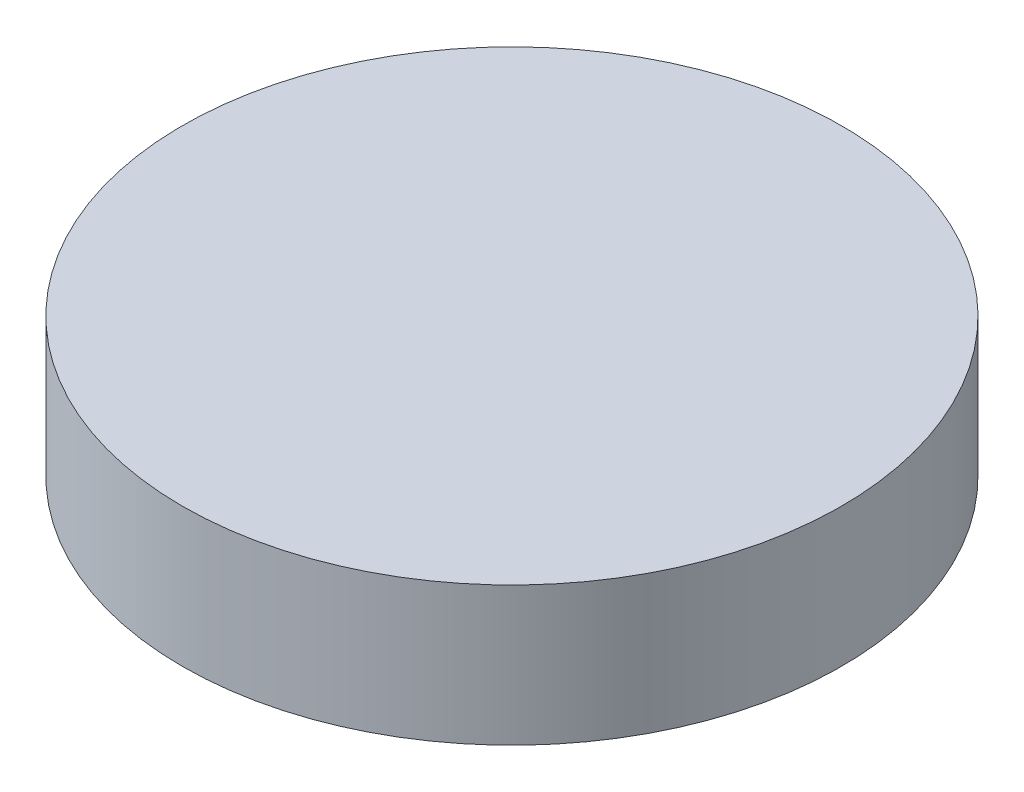
ISO-10303-21;
HEADER;
FILE_DESCRIPTION(('STEP AP214'),'2;1');
FILE_NAME('part.step','',(''),(''),'','','');
FILE_SCHEMA(('AUTOMOTIVE_DESIGN { 1 0 10303 214 1 1 1 1 }'));
ENDSEC;
DATA;
#1=APPLICATION_CONTEXT('core data for automotive mechanical design processes');
#2=APPLICATION_PROTOCOL_DEFINITION('international standard','automotive_design',2000,#1);
#3=PRODUCT_CONTEXT('',#1,'mechanical');
#4=PRODUCT('Part','Part','',(#3));
#5=PRODUCT_RELATED_PRODUCT_CATEGORY('part','',(#4));
#6=PRODUCT_DEFINITION_FORMATION('','',#4);
#7=PRODUCT_DEFINITION_CONTEXT('part definition',#1,'design');
#8=PRODUCT_DEFINITION('design','',#6,#7);
#9=PRODUCT_DEFINITION_SHAPE('','',#8);
#10=(LENGTH_UNIT() NAMED_UNIT(*) SI_UNIT(.MILLI.,.METRE.));
#11=(NAMED_UNIT(*) PLANE_ANGLE_UNIT() SI_UNIT($,.RADIAN.));
#12=(NAMED_UNIT(*) SI_UNIT($,.STERADIAN.) SOLID_ANGLE_UNIT());
#13=UNCERTAINTY_MEASURE_WITH_UNIT(LENGTH_MEASURE(1.E-05),#10,'distance_accuracy_value','');
#14=(GEOMETRIC_REPRESENTATION_CONTEXT(3) GLOBAL_UNCERTAINTY_ASSIGNED_CONTEXT((#13)) GLOBAL_UNIT_ASSIGNED_CONTEXT((#10,
#11,#12)) REPRESENTATION_CONTEXT('',''));
#15=CARTESIAN_POINT('',(0.,0.,0.));
#16=DIRECTION('',(0.,0.,1.));
#17=DIRECTION('',(1.,0.,0.));
#18=AXIS2_PLACEMENT_3D('',#15,#16,#17);
#19=CARTESIAN_POINT('',(0.,4.,0.));
#20=DIRECTION('',(0.,-1.,0.));
#21=DIRECTION('',(0.,0.,-1.));
#22=AXIS2_PLACEMENT_3D('',#19,#20,#21);
#23=CYLINDRICAL_SURFACE('',#22,9.5);
#24=CARTESIAN_POINT('',(0.,4.,0.));
#25=DIRECTION('',(0.,1.,0.));
#26=DIRECTION('',(0.,0.,1.));
#27=AXIS2_PLACEMENT_3D('',#24,#25,#26);
#28=CIRCLE('',#27,9.5);
#29=CARTESIAN_POINT('',(0.,4.,9.5));
#30=VERTEX_POINT('',#29);
#31=EDGE_CURVE('E10',#30,#30,#28,.T.);
#32=ORIENTED_EDGE('',*,*,#31,.F.);
#33=EDGE_LOOP('',(#32));
#34=FACE_BOUND('',#33,.T.);
#35=CARTESIAN_POINT('',(0.,0.,0.));
#36=DIRECTION('',(0.,1.,0.));
#37=DIRECTION('',(0.,0.,1.));
#38=AXIS2_PLACEMENT_3D('',#35,#36,#37);
#39=CIRCLE('',#38,9.5);
#40=CARTESIAN_POINT('',(0.,0.,9.5));
#41=VERTEX_POINT('',#40);
#42=EDGE_CURVE('E40',#41,#41,#39,.T.);
#43=ORIENTED_EDGE('',*,*,#42,.T.);
#44=EDGE_LOOP('',(#43));
#45=FACE_BOUND('',#44,.T.);
#46=ADVANCED_FACE('F37',(#34,#45),#23,.T.);
#47=CARTESIAN_POINT('',(0.,4.,0.));
#48=DIRECTION('',(0.,1.,0.));
#49=DIRECTION('',(0.,0.,1.));
#50=AXIS2_PLACEMENT_3D('',#47,#48,#49);
#51=PLANE('',#50);
#52=ORIENTED_EDGE('',*,*,#31,.T.);
#53=EDGE_LOOP('',(#52));
#54=FACE_BOUND('',#53,.T.);
#55=ADVANCED_FACE('F54',(#54),#51,.T.);
#56=CARTESIAN_POINT('',(0.,0.,0.));
#57=DIRECTION('',(0.,1.,0.));
#58=DIRECTION('',(0.,0.,1.));
#59=AXIS2_PLACEMENT_3D('',#56,#57,#58);
#60=PLANE('',#59);
#61=ORIENTED_EDGE('',*,*,#42,.F.);
#62=EDGE_LOOP('',(#61));
#63=FACE_BOUND('',#62,.T.);
#64=ADVANCED_FACE('F52',(#63),#60,.F.);
#65=CLOSED_SHELL('',(#46,#55,#64));
#66=MANIFOLD_SOLID_BREP('B2',#65);
#67=ADVANCED_BREP_SHAPE_REPRESENTATION('',(#18,#66),#14);
#68=SHAPE_DEFINITION_REPRESENTATION(#9,#67);
ENDSEC;
END-ISO-10303-21;
